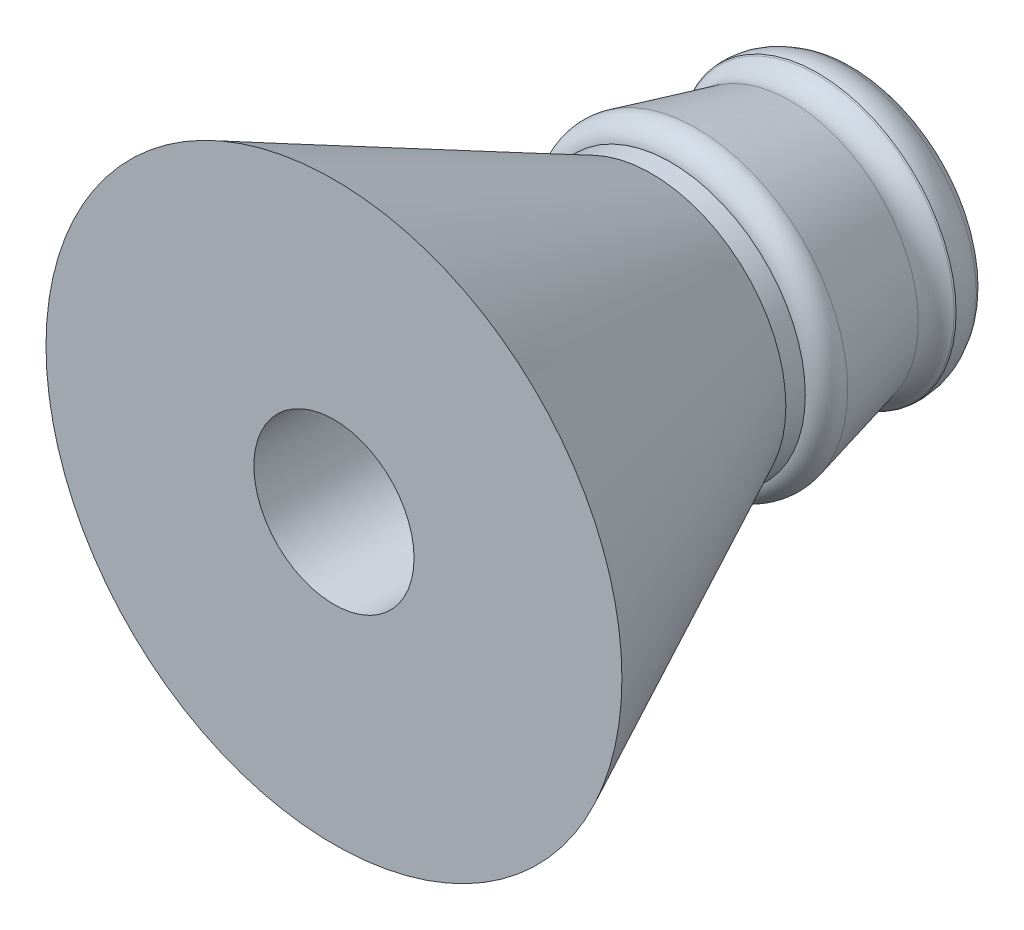
ISO-10303-21;
HEADER;
FILE_DESCRIPTION(('STEP AP214'),'2;1');
FILE_NAME('part.step','',(''),(''),'','','');
FILE_SCHEMA(('AUTOMOTIVE_DESIGN { 1 0 10303 214 1 1 1 1 }'));
ENDSEC;
DATA;
#1=APPLICATION_CONTEXT('core data for automotive mechanical design processes');
#2=APPLICATION_PROTOCOL_DEFINITION('international standard','automotive_design',2000,#1);
#3=PRODUCT_CONTEXT('',#1,'mechanical');
#4=PRODUCT('Part','Part','',(#3));
#5=PRODUCT_RELATED_PRODUCT_CATEGORY('part','',(#4));
#6=PRODUCT_DEFINITION_FORMATION('','',#4);
#7=PRODUCT_DEFINITION_CONTEXT('part definition',#1,'design');
#8=PRODUCT_DEFINITION('design','',#6,#7);
#9=PRODUCT_DEFINITION_SHAPE('','',#8);
#10=(LENGTH_UNIT() NAMED_UNIT(*) SI_UNIT(.MILLI.,.METRE.));
#11=(NAMED_UNIT(*) PLANE_ANGLE_UNIT() SI_UNIT($,.RADIAN.));
#12=(NAMED_UNIT(*) SI_UNIT($,.STERADIAN.) SOLID_ANGLE_UNIT());
#13=UNCERTAINTY_MEASURE_WITH_UNIT(LENGTH_MEASURE(1.E-05),#10,'distance_accuracy_value','');
#14=(GEOMETRIC_REPRESENTATION_CONTEXT(3) GLOBAL_UNCERTAINTY_ASSIGNED_CONTEXT((#13)) GLOBAL_UNIT_ASSIGNED_CONTEXT((#10,
#11,#12)) REPRESENTATION_CONTEXT('',''));
#15=CARTESIAN_POINT('',(0.,0.,0.));
#16=DIRECTION('',(0.,0.,1.));
#17=DIRECTION('',(1.,0.,0.));
#18=AXIS2_PLACEMENT_3D('',#15,#16,#17);
#19=CARTESIAN_POINT('',(-7.75,0.,30.7252502221827));
#20=DIRECTION('',(0.,0.,-1.));
#21=DIRECTION('',(-1.,0.,0.));
#22=AXIS2_PLACEMENT_3D('',#19,#20,#21);
#23=PLANE('',#22);
#24=CARTESIAN_POINT('',(0.,0.,30.7252502221827));
#25=DIRECTION('',(0.,0.,1.));
#26=DIRECTION('',(1.,0.,0.));
#27=AXIS2_PLACEMENT_3D('',#24,#25,#26);
#28=CIRCLE('',#27,7.75);
#29=CARTESIAN_POINT('',(7.75,0.,30.7252502221827));
#30=VERTEX_POINT('',#29);
#31=EDGE_CURVE('E10',#30,#30,#28,.T.);
#32=ORIENTED_EDGE('',*,*,#31,.F.);
#33=EDGE_LOOP('',(#32));
#34=FACE_BOUND('',#33,.T.);
#35=CARTESIAN_POINT('',(0.,0.,30.7252502221827));
#36=DIRECTION('',(0.,0.,1.));
#37=DIRECTION('',(1.,0.,0.));
#38=AXIS2_PLACEMENT_3D('',#35,#36,#37);
#39=CIRCLE('',#38,27.8635159145628);
#40=CARTESIAN_POINT('',(27.8635159145628,0.,30.7252502221827));
#41=VERTEX_POINT('',#40);
#42=EDGE_CURVE('E46',#41,#41,#39,.T.);
#43=ORIENTED_EDGE('',*,*,#42,.T.);
#44=EDGE_LOOP('',(#43));
#45=FACE_BOUND('',#44,.T.);
#46=ADVANCED_FACE('F39',(#34,#45),#23,.F.);
#47=CARTESIAN_POINT('',(0.,0.,0.));
#48=DIRECTION('',(0.,0.,1.));
#49=DIRECTION('',(1.,0.,0.));
#50=AXIS2_PLACEMENT_3D('',#47,#48,#49);
#51=CONICAL_SURFACE('',#50,13.,0.450567947940033);
#52=ORIENTED_EDGE('',*,*,#42,.F.);
#53=EDGE_LOOP('',(#52));
#54=FACE_BOUND('',#53,.T.);
#55=CARTESIAN_POINT('',(0.,0.,0.));
#56=DIRECTION('',(0.,0.,1.));
#57=DIRECTION('',(1.,0.,0.));
#58=AXIS2_PLACEMENT_3D('',#55,#56,#57);
#59=CIRCLE('',#58,13.);
#60=CARTESIAN_POINT('',(13.,0.,0.));
#61=VERTEX_POINT('',#60);
#62=EDGE_CURVE('E51',#61,#61,#59,.T.);
#63=ORIENTED_EDGE('',*,*,#62,.T.);
#64=EDGE_LOOP('',(#63));
#65=FACE_BOUND('',#64,.T.);
#66=ADVANCED_FACE('F115',(#54,#65),#51,.T.);
#67=CARTESIAN_POINT('',(0.,0.,0.));
#68=DIRECTION('',(0.,0.,1.));
#69=DIRECTION('',(1.,0.,0.));
#70=AXIS2_PLACEMENT_3D('',#67,#68,#69);
#71=CYLINDRICAL_SURFACE('',#70,13.);
#72=ORIENTED_EDGE('',*,*,#62,.F.);
#73=EDGE_LOOP('',(#72));
#74=FACE_BOUND('',#73,.T.);
#75=CARTESIAN_POINT('',(0.,0.,-1.88219784105784));
#76=DIRECTION('',(0.,0.,1.));
#77=DIRECTION('',(1.,0.,0.));
#78=AXIS2_PLACEMENT_3D('',#75,#76,#77);
#79=CIRCLE('',#78,13.);
#80=CARTESIAN_POINT('',(13.,0.,-1.88219784105784));
#81=VERTEX_POINT('',#80);
#82=EDGE_CURVE('E56',#81,#81,#79,.T.);
#83=ORIENTED_EDGE('',*,*,#82,.T.);
#84=EDGE_LOOP('',(#83));
#85=FACE_BOUND('',#84,.T.);
#86=ADVANCED_FACE('F120',(#74,#85),#71,.T.);
#87=CARTESIAN_POINT('',(0.,0.,-3.85956983438636));
#88=DIRECTION('',(0.,0.,1.));
#89=DIRECTION('',(1.,0.,0.));
#90=AXIS2_PLACEMENT_3D('',#87,#88,#89);
#91=TOROIDAL_SURFACE('',#90,12.7,2.);
#92=ORIENTED_EDGE('',*,*,#82,.F.);
#93=EDGE_LOOP('',(#92));
#94=FACE_BOUND('',#93,.T.);
#95=CARTESIAN_POINT('',(0.,0.,-4.34333566106431));
#96=DIRECTION('',(0.,0.,1.));
#97=DIRECTION('',(1.,0.,0.));
#98=AXIS2_PLACEMENT_3D('',#95,#96,#97);
#99=CIRCLE('',#98,14.6406108896269);
#100=CARTESIAN_POINT('',(14.6406108896269,0.,-4.34333566106431));
#101=VERTEX_POINT('',#100);
#102=EDGE_CURVE('E62',#101,#101,#99,.T.);
#103=ORIENTED_EDGE('',*,*,#102,.T.);
#104=EDGE_LOOP('',(#103));
#105=FACE_BOUND('',#104,.T.);
#106=ADVANCED_FACE('F125',(#94,#105),#91,.T.);
#107=CARTESIAN_POINT('',(0.,0.,-13.4467351836246));
#108=DIRECTION('',(0.,0.,1.));
#109=DIRECTION('',(1.,0.,0.));
#110=AXIS2_PLACEMENT_3D('',#107,#108,#109);
#111=CONICAL_SURFACE('',#110,12.3712669324477,0.244305919831241);
#112=ORIENTED_EDGE('',*,*,#102,.F.);
#113=EDGE_LOOP('',(#112));
#114=FACE_BOUND('',#113,.T.);
#115=CARTESIAN_POINT('',(0.,0.,-13.4467351836246));
#116=DIRECTION('',(0.,0.,1.));
#117=DIRECTION('',(1.,0.,0.));
#118=AXIS2_PLACEMENT_3D('',#115,#116,#117);
#119=CIRCLE('',#118,12.3712669324477);
#120=CARTESIAN_POINT('',(12.3712669324477,0.,-13.4467351836246));
#121=VERTEX_POINT('',#120);
#122=EDGE_CURVE('E66',#121,#121,#119,.T.);
#123=ORIENTED_EDGE('',*,*,#122,.T.);
#124=EDGE_LOOP('',(#123));
#125=FACE_BOUND('',#124,.T.);
#126=ADVANCED_FACE('F132',(#114,#125),#111,.T.);
#127=CARTESIAN_POINT('',(0.,0.,-14.0272541756381));
#128=DIRECTION('',(0.,0.,1.));
#129=DIRECTION('',(1.,0.,0.));
#130=AXIS2_PLACEMENT_3D('',#127,#128,#129);
#131=TOROIDAL_SURFACE('',#130,14.7,2.4);
#132=ORIENTED_EDGE('',*,*,#122,.F.);
#133=EDGE_LOOP('',(#132));
#134=FACE_BOUND('',#133,.T.);
#135=CARTESIAN_POINT('',(0.,0.,-15.9772541756381));
#136=DIRECTION('',(0.,0.,1.));
#137=DIRECTION('',(1.,0.,0.));
#138=AXIS2_PLACEMENT_3D('',#135,#136,#137);
#139=CIRCLE('',#138,13.3008931420367);
#140=CARTESIAN_POINT('',(13.3008931420367,0.,-15.9772541756381));
#141=VERTEX_POINT('',#140);
#142=EDGE_CURVE('E70',#141,#141,#139,.T.);
#143=ORIENTED_EDGE('',*,*,#142,.T.);
#144=EDGE_LOOP('',(#143));
#145=FACE_BOUND('',#144,.T.);
#146=ADVANCED_FACE('F136',(#134,#145),#131,.F.);
#147=CARTESIAN_POINT('',(0.,0.,-16.3835041756381));
#148=DIRECTION('',(0.,0.,1.));
#149=DIRECTION('',(1.,0.,0.));
#150=AXIS2_PLACEMENT_3D('',#147,#148,#149);
#151=TOROIDAL_SURFACE('',#150,13.0094125466276,0.5);
#152=ORIENTED_EDGE('',*,*,#142,.F.);
#153=EDGE_LOOP('',(#152));
#154=FACE_BOUND('',#153,.T.);
#155=CARTESIAN_POINT('',(0.,0.,-16.0713480588182));
#156=DIRECTION('',(0.,0.,1.));
#157=DIRECTION('',(1.,0.,0.));
#158=AXIS2_PLACEMENT_3D('',#155,#156,#157);
#159=CIRCLE('',#158,13.4);
#160=CARTESIAN_POINT('',(13.4,0.,-16.0713480588182));
#161=VERTEX_POINT('',#160);
#162=EDGE_CURVE('E74',#161,#161,#159,.T.);
#163=ORIENTED_EDGE('',*,*,#162,.T.);
#164=EDGE_LOOP('',(#163));
#165=FACE_BOUND('',#164,.T.);
#166=ADVANCED_FACE('F140',(#154,#165),#151,.T.);
#167=CARTESIAN_POINT('',(0.,0.,-16.4772541756381));
#168=DIRECTION('',(0.,0.,1.));
#169=DIRECTION('',(1.,0.,0.));
#170=AXIS2_PLACEMENT_3D('',#167,#168,#169);
#171=TOROIDAL_SURFACE('',#170,9.42064826581915,4.);
#172=ORIENTED_EDGE('',*,*,#162,.F.);
#173=EDGE_LOOP('',(#172));
#174=FACE_BOUND('',#173,.T.);
#175=CARTESIAN_POINT('',(0.,0.,-18.7034067206364));
#176=DIRECTION('',(0.,0.,1.));
#177=DIRECTION('',(1.,0.,0.));
#178=AXIS2_PLACEMENT_3D('',#175,#176,#177);
#179=CIRCLE('',#178,12.743936523915);
#180=CARTESIAN_POINT('',(12.743936523915,0.,-18.7034067206364));
#181=VERTEX_POINT('',#180);
#182=EDGE_CURVE('E78',#181,#181,#179,.T.);
#183=ORIENTED_EDGE('',*,*,#182,.T.);
#184=EDGE_LOOP('',(#183));
#185=FACE_BOUND('',#184,.T.);
#186=ADVANCED_FACE('F144',(#174,#185),#171,.T.);
#187=CARTESIAN_POINT('',(0.,0.,-17.5772541756381));
#188=DIRECTION('',(0.,0.,1.));
#189=DIRECTION('',(1.,0.,0.));
#190=AXIS2_PLACEMENT_3D('',#187,#188,#189);
#191=TOROIDAL_SURFACE('',#190,10.6245544334476,2.4);
#192=ORIENTED_EDGE('',*,*,#182,.F.);
#193=EDGE_LOOP('',(#192));
#194=FACE_BOUND('',#193,.T.);
#195=CARTESIAN_POINT('',(0.,0.,-19.9772541756381));
#196=DIRECTION('',(0.,0.,1.));
#197=DIRECTION('',(1.,0.,0.));
#198=AXIS2_PLACEMENT_3D('',#195,#196,#197);
#199=CIRCLE('',#198,10.6245544334476);
#200=CARTESIAN_POINT('',(10.6245544334476,0.,-19.9772541756381));
#201=VERTEX_POINT('',#200);
#202=EDGE_CURVE('E82',#201,#201,#199,.T.);
#203=ORIENTED_EDGE('',*,*,#202,.T.);
#204=EDGE_LOOP('',(#203));
#205=FACE_BOUND('',#204,.T.);
#206=ADVANCED_FACE('F148',(#194,#205),#191,.T.);
#207=CARTESIAN_POINT('',(-10.6245544334476,0.,-19.9772541756381));
#208=DIRECTION('',(0.,0.,1.));
#209=DIRECTION('',(1.,0.,0.));
#210=AXIS2_PLACEMENT_3D('',#207,#208,#209);
#211=PLANE('',#210);
#212=ORIENTED_EDGE('',*,*,#202,.F.);
#213=EDGE_LOOP('',(#212));
#214=FACE_BOUND('',#213,.T.);
#215=CARTESIAN_POINT('',(0.,0.,-19.9772541756381));
#216=DIRECTION('',(0.,0.,1.));
#217=DIRECTION('',(1.,0.,0.));
#218=AXIS2_PLACEMENT_3D('',#215,#216,#217);
#219=CIRCLE('',#218,9.75);
#220=CARTESIAN_POINT('',(9.75,0.,-19.9772541756381));
#221=VERTEX_POINT('',#220);
#222=EDGE_CURVE('E86',#221,#221,#219,.T.);
#223=ORIENTED_EDGE('',*,*,#222,.T.);
#224=EDGE_LOOP('',(#223));
#225=FACE_BOUND('',#224,.T.);
#226=ADVANCED_FACE('F152',(#214,#225),#211,.F.);
#227=CARTESIAN_POINT('',(0.,0.,-19.4772541756381));
#228=DIRECTION('',(0.,0.,1.));
#229=DIRECTION('',(1.,0.,0.));
#230=AXIS2_PLACEMENT_3D('',#227,#228,#229);
#231=TOROIDAL_SURFACE('',#230,9.75,0.5);
#232=ORIENTED_EDGE('',*,*,#222,.F.);
#233=EDGE_LOOP('',(#232));
#234=FACE_BOUND('',#233,.T.);
#235=CARTESIAN_POINT('',(0.,0.,-19.4772541756381));
#236=DIRECTION('',(0.,0.,1.));
#237=DIRECTION('',(1.,0.,0.));
#238=AXIS2_PLACEMENT_3D('',#235,#236,#237);
#239=CIRCLE('',#238,9.25);
#240=CARTESIAN_POINT('',(9.25,0.,-19.4772541756381));
#241=VERTEX_POINT('',#240);
#242=EDGE_CURVE('E90',#241,#241,#239,.T.);
#243=ORIENTED_EDGE('',*,*,#242,.T.);
#244=EDGE_LOOP('',(#243));
#245=FACE_BOUND('',#244,.T.);
#246=ADVANCED_FACE('F156',(#234,#245),#231,.T.);
#247=CARTESIAN_POINT('',(0.,0.,0.));
#248=DIRECTION('',(0.,0.,1.));
#249=DIRECTION('',(1.,0.,0.));
#250=AXIS2_PLACEMENT_3D('',#247,#248,#249);
#251=CYLINDRICAL_SURFACE('',#250,9.25);
#252=ORIENTED_EDGE('',*,*,#242,.F.);
#253=EDGE_LOOP('',(#252));
#254=FACE_BOUND('',#253,.T.);
#255=CARTESIAN_POINT('',(0.,0.,-14.4131548140668));
#256=DIRECTION('',(0.,0.,1.));
#257=DIRECTION('',(1.,0.,0.));
#258=AXIS2_PLACEMENT_3D('',#255,#256,#257);
#259=CIRCLE('',#258,9.25);
#260=CARTESIAN_POINT('',(9.25,0.,-14.4131548140668));
#261=VERTEX_POINT('',#260);
#262=EDGE_CURVE('E94',#261,#261,#259,.T.);
#263=ORIENTED_EDGE('',*,*,#262,.T.);
#264=EDGE_LOOP('',(#263));
#265=FACE_BOUND('',#264,.T.);
#266=ADVANCED_FACE('F111',(#254,#265),#251,.F.);
#267=CARTESIAN_POINT('',(0.,0.,-10.5591624163467));
#268=DIRECTION('',(0.,0.,1.));
#269=DIRECTION('',(1.,0.,0.));
#270=AXIS2_PLACEMENT_3D('',#267,#268,#269);
#271=DEGENERATE_TOROIDAL_SURFACE('',#270,2.69803840350539,12.5542374954962,.F.);
#272=ORIENTED_EDGE('',*,*,#262,.F.);
#273=EDGE_LOOP('',(#272));
#274=FACE_BOUND('',#273,.T.);
#275=CARTESIAN_POINT('',(0.,0.,-3.59874772954821));
#276=DIRECTION('',(0.,0.,1.));
#277=DIRECTION('',(1.,0.,0.));
#278=AXIS2_PLACEMENT_3D('',#275,#276,#277);
#279=CIRCLE('',#278,7.75);
#280=CARTESIAN_POINT('',(7.75,0.,-3.59874772954821));
#281=VERTEX_POINT('',#280);
#282=EDGE_CURVE('E98',#281,#281,#279,.T.);
#283=ORIENTED_EDGE('',*,*,#282,.T.);
#284=EDGE_LOOP('',(#283));
#285=FACE_BOUND('',#284,.T.);
#286=ADVANCED_FACE('F103',(#274,#285),#271,.T.);
#287=CARTESIAN_POINT('',(0.,0.,0.));
#288=DIRECTION('',(0.,0.,1.));
#289=DIRECTION('',(1.,0.,0.));
#290=AXIS2_PLACEMENT_3D('',#287,#288,#289);
#291=CYLINDRICAL_SURFACE('',#290,7.75);
#292=ORIENTED_EDGE('',*,*,#282,.F.);
#293=EDGE_LOOP('',(#292));
#294=FACE_BOUND('',#293,.T.);
#295=ORIENTED_EDGE('',*,*,#31,.T.);
#296=EDGE_LOOP('',(#295));
#297=FACE_BOUND('',#296,.T.);
#298=ADVANCED_FACE('F105',(#294,#297),#291,.F.);
#299=CLOSED_SHELL('',(#46,#66,#86,#106,#126,#146,#166,#186,#206,#226,#246,#266,#286,#298));
#300=MANIFOLD_SOLID_BREP('B2',#299);
#301=ADVANCED_BREP_SHAPE_REPRESENTATION('',(#18,#300),#14);
#302=SHAPE_DEFINITION_REPRESENTATION(#9,#301);
ENDSEC;
END-ISO-10303-21;
